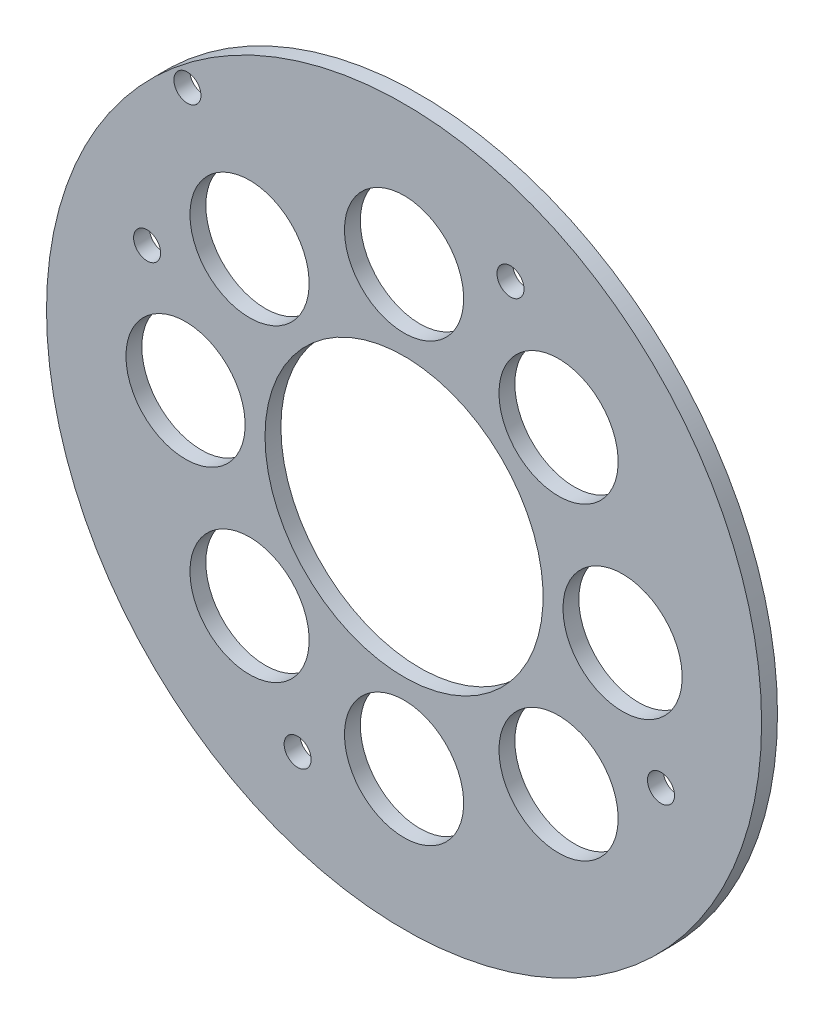
ISO-10303-21;
HEADER;
FILE_DESCRIPTION(('STEP AP214'),'2;1');
FILE_NAME('part.step','',(''),(''),'','','');
FILE_SCHEMA(('AUTOMOTIVE_DESIGN { 1 0 10303 214 1 1 1 1 }'));
ENDSEC;
DATA;
#1=APPLICATION_CONTEXT('core data for automotive mechanical design processes');
#2=APPLICATION_PROTOCOL_DEFINITION('international standard','automotive_design',2000,#1);
#3=PRODUCT_CONTEXT('',#1,'mechanical');
#4=PRODUCT('Part','Part','',(#3));
#5=PRODUCT_RELATED_PRODUCT_CATEGORY('part','',(#4));
#6=PRODUCT_DEFINITION_FORMATION('','',#4);
#7=PRODUCT_DEFINITION_CONTEXT('part definition',#1,'design');
#8=PRODUCT_DEFINITION('design','',#6,#7);
#9=PRODUCT_DEFINITION_SHAPE('','',#8);
#10=(LENGTH_UNIT() NAMED_UNIT(*) SI_UNIT(.MILLI.,.METRE.));
#11=(NAMED_UNIT(*) PLANE_ANGLE_UNIT() SI_UNIT($,.RADIAN.));
#12=(NAMED_UNIT(*) SI_UNIT($,.STERADIAN.) SOLID_ANGLE_UNIT());
#13=UNCERTAINTY_MEASURE_WITH_UNIT(LENGTH_MEASURE(1.E-05),#10,'distance_accuracy_value','');
#14=(GEOMETRIC_REPRESENTATION_CONTEXT(3) GLOBAL_UNCERTAINTY_ASSIGNED_CONTEXT((#13)) GLOBAL_UNIT_ASSIGNED_CONTEXT((#10,
#11,#12)) REPRESENTATION_CONTEXT('',''));
#15=CARTESIAN_POINT('',(0.,0.,0.));
#16=DIRECTION('',(0.,0.,1.));
#17=DIRECTION('',(1.,0.,0.));
#18=AXIS2_PLACEMENT_3D('',#15,#16,#17);
#19=CARTESIAN_POINT('',(0.,0.,14.));
#20=DIRECTION('',(0.,0.,1.));
#21=DIRECTION('',(1.,0.,0.));
#22=AXIS2_PLACEMENT_3D('',#19,#20,#21);
#23=PLANE('',#22);
#24=CARTESIAN_POINT('',(0.,0.,14.));
#25=DIRECTION('',(0.,0.,-1.));
#26=DIRECTION('',(-1.,0.,0.));
#27=AXIS2_PLACEMENT_3D('',#24,#25,#26);
#28=CIRCLE('',#27,17.5);
#29=CARTESIAN_POINT('',(-17.5,0.,14.));
#30=VERTEX_POINT('',#29);
#31=EDGE_CURVE('E133',#30,#30,#28,.T.);
#32=ORIENTED_EDGE('',*,*,#31,.T.);
#33=EDGE_LOOP('',(#32));
#34=FACE_BOUND('',#33,.T.);
#35=CARTESIAN_POINT('',(13.393920132778,32.3357836378951,14.));
#36=DIRECTION('',(0.,0.,-1.));
#37=DIRECTION('',(-1.,0.,0.));
#38=AXIS2_PLACEMENT_3D('',#35,#36,#37);
#39=CIRCLE('',#38,1.7);
#40=CARTESIAN_POINT('',(11.693920132778,32.3357836378951,14.));
#41=VERTEX_POINT('',#40);
#42=EDGE_CURVE('E94',#41,#41,#39,.T.);
#43=ORIENTED_EDGE('',*,*,#42,.T.);
#44=EDGE_LOOP('',(#43));
#45=FACE_BOUND('',#44,.T.);
#46=CARTESIAN_POINT('',(-13.3939201327779,-32.3357836378951,14.));
#47=DIRECTION('',(0.,0.,-1.));
#48=DIRECTION('',(-1.,0.,0.));
#49=AXIS2_PLACEMENT_3D('',#46,#47,#48);
#50=CIRCLE('',#49,1.7);
#51=CARTESIAN_POINT('',(-15.0939201327779,-32.3357836378951,14.));
#52=VERTEX_POINT('',#51);
#53=EDGE_CURVE('E91',#52,#52,#50,.T.);
#54=ORIENTED_EDGE('',*,*,#53,.T.);
#55=EDGE_LOOP('',(#54));
#56=FACE_BOUND('',#55,.T.);
#57=CARTESIAN_POINT('',(-32.3357836378951,13.393920132778,14.));
#58=DIRECTION('',(0.,0.,-1.));
#59=DIRECTION('',(-1.,0.,0.));
#60=AXIS2_PLACEMENT_3D('',#57,#58,#59);
#61=CIRCLE('',#60,1.7);
#62=CARTESIAN_POINT('',(-34.0357836378951,13.393920132778,14.));
#63=VERTEX_POINT('',#62);
#64=EDGE_CURVE('E88',#63,#63,#61,.T.);
#65=ORIENTED_EDGE('',*,*,#64,.T.);
#66=EDGE_LOOP('',(#65));
#67=FACE_BOUND('',#66,.T.);
#68=CARTESIAN_POINT('',(32.3357836378951,-13.3939201327779,14.));
#69=DIRECTION('',(0.,0.,-1.));
#70=DIRECTION('',(-1.,0.,0.));
#71=AXIS2_PLACEMENT_3D('',#68,#69,#70);
#72=CIRCLE('',#71,1.7);
#73=CARTESIAN_POINT('',(30.6357836378951,-13.3939201327779,14.));
#74=VERTEX_POINT('',#73);
#75=EDGE_CURVE('E85',#74,#74,#72,.T.);
#76=ORIENTED_EDGE('',*,*,#75,.T.);
#77=EDGE_LOOP('',(#76));
#78=FACE_BOUND('',#77,.T.);
#79=CARTESIAN_POINT('',(19.4454364826294,19.4454364826285,14.));
#80=DIRECTION('',(0.,0.,-1.));
#81=DIRECTION('',(-1.,0.,0.));
#82=AXIS2_PLACEMENT_3D('',#79,#80,#81);
#83=CIRCLE('',#82,7.5);
#84=CARTESIAN_POINT('',(11.9454364826294,19.4454364826285,14.));
#85=VERTEX_POINT('',#84);
#86=EDGE_CURVE('E82',#85,#85,#83,.T.);
#87=ORIENTED_EDGE('',*,*,#86,.T.);
#88=EDGE_LOOP('',(#87));
#89=FACE_BOUND('',#88,.T.);
#90=CARTESIAN_POINT('',(27.4999999999979,-2.13208744982998E-12,14.));
#91=DIRECTION('',(0.,0.,-1.));
#92=DIRECTION('',(-1.,0.,0.));
#93=AXIS2_PLACEMENT_3D('',#90,#91,#92);
#94=CIRCLE('',#93,7.5);
#95=CARTESIAN_POINT('',(19.9999999999979,-2.13208744982998E-12,14.));
#96=VERTEX_POINT('',#95);
#97=EDGE_CURVE('E79',#96,#96,#94,.T.);
#98=ORIENTED_EDGE('',*,*,#97,.T.);
#99=EDGE_LOOP('',(#98));
#100=FACE_BOUND('',#99,.T.);
#101=CARTESIAN_POINT('',(19.4454364826264,-19.4454364826316,14.));
#102=DIRECTION('',(0.,0.,-1.));
#103=DIRECTION('',(-1.,0.,0.));
#104=AXIS2_PLACEMENT_3D('',#101,#102,#103);
#105=CIRCLE('',#104,7.5);
#106=CARTESIAN_POINT('',(11.9454364826264,-19.4454364826316,14.));
#107=VERTEX_POINT('',#106);
#108=EDGE_CURVE('E76',#107,#107,#105,.T.);
#109=ORIENTED_EDGE('',*,*,#108,.T.);
#110=EDGE_LOOP('',(#109));
#111=FACE_BOUND('',#110,.T.);
#112=CARTESIAN_POINT('',(-4.25743934226465E-12,-27.5,14.));
#113=DIRECTION('',(0.,0.,-1.));
#114=DIRECTION('',(-1.,0.,0.));
#115=AXIS2_PLACEMENT_3D('',#112,#113,#114);
#116=CIRCLE('',#115,7.5);
#117=CARTESIAN_POINT('',(-7.50000000000426,-27.5,14.));
#118=VERTEX_POINT('',#117);
#119=EDGE_CURVE('E73',#118,#118,#116,.T.);
#120=ORIENTED_EDGE('',*,*,#119,.T.);
#121=EDGE_LOOP('',(#120));
#122=FACE_BOUND('',#121,.T.);
#123=CARTESIAN_POINT('',(-19.4454364826337,-19.4454364826286,14.));
#124=DIRECTION('',(0.,0.,-1.));
#125=DIRECTION('',(-1.,0.,0.));
#126=AXIS2_PLACEMENT_3D('',#123,#124,#125);
#127=CIRCLE('',#126,7.5);
#128=CARTESIAN_POINT('',(-26.9454364826337,-19.4454364826286,14.));
#129=VERTEX_POINT('',#128);
#130=EDGE_CURVE('E70',#129,#129,#127,.T.);
#131=ORIENTED_EDGE('',*,*,#130,.T.);
#132=EDGE_LOOP('',(#131));
#133=FACE_BOUND('',#132,.T.);
#134=CARTESIAN_POINT('',(-27.5000000000021,2.12871967113233E-12,14.));
#135=DIRECTION('',(0.,0.,-1.));
#136=DIRECTION('',(-1.,0.,0.));
#137=AXIS2_PLACEMENT_3D('',#134,#135,#136);
#138=CIRCLE('',#137,7.49999999999999);
#139=CARTESIAN_POINT('',(-35.0000000000021,2.12871967113233E-12,14.));
#140=VERTEX_POINT('',#139);
#141=EDGE_CURVE('E65',#140,#140,#138,.T.);
#142=ORIENTED_EDGE('',*,*,#141,.T.);
#143=EDGE_LOOP('',(#142));
#144=FACE_BOUND('',#143,.T.);
#145=CARTESIAN_POINT('',(-19.4454364826307,19.4454364826316,14.));
#146=DIRECTION('',(0.,0.,-1.));
#147=DIRECTION('',(-1.,0.,0.));
#148=AXIS2_PLACEMENT_3D('',#145,#146,#147);
#149=CIRCLE('',#148,7.5);
#150=CARTESIAN_POINT('',(-26.9454364826307,19.4454364826316,14.));
#151=VERTEX_POINT('',#150);
#152=EDGE_CURVE('E61',#151,#151,#149,.T.);
#153=ORIENTED_EDGE('',*,*,#152,.T.);
#154=EDGE_LOOP('',(#153));
#155=FACE_BOUND('',#154,.T.);
#156=CARTESIAN_POINT('',(0.,27.5,14.));
#157=DIRECTION('',(0.,0.,-1.));
#158=DIRECTION('',(-1.,0.,0.));
#159=AXIS2_PLACEMENT_3D('',#156,#157,#158);
#160=CIRCLE('',#159,7.5);
#161=CARTESIAN_POINT('',(-7.5,27.5,14.));
#162=VERTEX_POINT('',#161);
#163=EDGE_CURVE('E57',#162,#162,#160,.T.);
#164=ORIENTED_EDGE('',*,*,#163,.T.);
#165=EDGE_LOOP('',(#164));
#166=FACE_BOUND('',#165,.T.);
#167=CARTESIAN_POINT('',(-27.2631166743693,33.1207642969602,14.));
#168=DIRECTION('',(0.,0.,1.));
#169=DIRECTION('',(1.,0.,0.));
#170=AXIS2_PLACEMENT_3D('',#167,#168,#169);
#171=CIRCLE('',#170,1.7);
#172=CARTESIAN_POINT('',(-25.5631166743693,33.1207642969602,14.));
#173=VERTEX_POINT('',#172);
#174=EDGE_CURVE('E51',#173,#173,#171,.T.);
#175=ORIENTED_EDGE('',*,*,#174,.F.);
#176=EDGE_LOOP('',(#175));
#177=FACE_BOUND('',#176,.T.);
#178=CARTESIAN_POINT('',(0.,0.,14.));
#179=DIRECTION('',(0.,0.,1.));
#180=DIRECTION('',(1.,0.,0.));
#181=AXIS2_PLACEMENT_3D('',#178,#179,#180);
#182=CIRCLE('',#181,45.);
#183=CARTESIAN_POINT('',(45.,0.,14.));
#184=VERTEX_POINT('',#183);
#185=EDGE_CURVE('E10',#184,#184,#182,.T.);
#186=ORIENTED_EDGE('',*,*,#185,.T.);
#187=EDGE_LOOP('',(#186));
#188=FACE_BOUND('',#187,.T.);
#189=ADVANCED_FACE('F35',(#34,#45,#56,#67,#78,#89,#100,#111,#122,#133,#144,#155,#166,#177,#188),
#23,.T.);
#190=CARTESIAN_POINT('',(0.,0.,12.));
#191=DIRECTION('',(0.,0.,1.));
#192=DIRECTION('',(1.,0.,0.));
#193=AXIS2_PLACEMENT_3D('',#190,#191,#192);
#194=PLANE('',#193);
#195=CARTESIAN_POINT('',(0.,0.,12.));
#196=DIRECTION('',(0.,0.,-1.));
#197=DIRECTION('',(-1.,0.,0.));
#198=AXIS2_PLACEMENT_3D('',#195,#196,#197);
#199=CIRCLE('',#198,17.5);
#200=CARTESIAN_POINT('',(-17.5,0.,12.));
#201=VERTEX_POINT('',#200);
#202=EDGE_CURVE('E130',#201,#201,#199,.T.);
#203=ORIENTED_EDGE('',*,*,#202,.F.);
#204=EDGE_LOOP('',(#203));
#205=FACE_BOUND('',#204,.T.);
#206=CARTESIAN_POINT('',(-27.2631166743693,33.1207642969602,12.));
#207=DIRECTION('',(0.,0.,1.));
#208=DIRECTION('',(1.,0.,0.));
#209=AXIS2_PLACEMENT_3D('',#206,#207,#208);
#210=CIRCLE('',#209,1.7);
#211=CARTESIAN_POINT('',(-25.5631166743693,33.1207642969602,12.));
#212=VERTEX_POINT('',#211);
#213=EDGE_CURVE('E48',#212,#212,#210,.T.);
#214=ORIENTED_EDGE('',*,*,#213,.T.);
#215=EDGE_LOOP('',(#214));
#216=FACE_BOUND('',#215,.T.);
#217=CARTESIAN_POINT('',(0.,0.,12.));
#218=DIRECTION('',(0.,0.,1.));
#219=DIRECTION('',(1.,0.,0.));
#220=AXIS2_PLACEMENT_3D('',#217,#218,#219);
#221=CIRCLE('',#220,45.);
#222=CARTESIAN_POINT('',(45.,0.,12.));
#223=VERTEX_POINT('',#222);
#224=EDGE_CURVE('E43',#223,#223,#221,.T.);
#225=ORIENTED_EDGE('',*,*,#224,.F.);
#226=EDGE_LOOP('',(#225));
#227=FACE_BOUND('',#226,.T.);
#228=CARTESIAN_POINT('',(-19.4454364826307,19.4454364826316,12.));
#229=DIRECTION('',(0.,0.,1.));
#230=DIRECTION('',(1.,0.,0.));
#231=AXIS2_PLACEMENT_3D('',#228,#229,#230);
#232=CIRCLE('',#231,7.5);
#233=CARTESIAN_POINT('',(-11.9454364826307,19.4454364826316,12.));
#234=VERTEX_POINT('',#233);
#235=EDGE_CURVE('E100',#234,#234,#232,.F.);
#236=ORIENTED_EDGE('',*,*,#235,.F.);
#237=EDGE_LOOP('',(#236));
#238=FACE_BOUND('',#237,.T.);
#239=CARTESIAN_POINT('',(-19.4454364826337,-19.4454364826286,12.));
#240=DIRECTION('',(0.,0.,1.));
#241=DIRECTION('',(1.,0.,0.));
#242=AXIS2_PLACEMENT_3D('',#239,#240,#241);
#243=CIRCLE('',#242,7.5);
#244=CARTESIAN_POINT('',(-11.9454364826337,-19.4454364826286,12.));
#245=VERTEX_POINT('',#244);
#246=EDGE_CURVE('E106',#245,#245,#243,.F.);
#247=ORIENTED_EDGE('',*,*,#246,.F.);
#248=EDGE_LOOP('',(#247));
#249=FACE_BOUND('',#248,.T.);
#250=CARTESIAN_POINT('',(19.4454364826264,-19.4454364826316,12.));
#251=DIRECTION('',(0.,0.,1.));
#252=DIRECTION('',(1.,0.,0.));
#253=AXIS2_PLACEMENT_3D('',#250,#251,#252);
#254=CIRCLE('',#253,7.5);
#255=CARTESIAN_POINT('',(26.9454364826264,-19.4454364826316,12.));
#256=VERTEX_POINT('',#255);
#257=EDGE_CURVE('E112',#256,#256,#254,.F.);
#258=ORIENTED_EDGE('',*,*,#257,.F.);
#259=EDGE_LOOP('',(#258));
#260=FACE_BOUND('',#259,.T.);
#261=CARTESIAN_POINT('',(19.4454364826294,19.4454364826285,12.));
#262=DIRECTION('',(0.,0.,1.));
#263=DIRECTION('',(1.,0.,0.));
#264=AXIS2_PLACEMENT_3D('',#261,#262,#263);
#265=CIRCLE('',#264,7.5);
#266=CARTESIAN_POINT('',(26.9454364826294,19.4454364826285,12.));
#267=VERTEX_POINT('',#266);
#268=EDGE_CURVE('E118',#267,#267,#265,.F.);
#269=ORIENTED_EDGE('',*,*,#268,.F.);
#270=EDGE_LOOP('',(#269));
#271=FACE_BOUND('',#270,.T.);
#272=CARTESIAN_POINT('',(-32.3357836378951,13.393920132778,12.));
#273=DIRECTION('',(0.,0.,1.));
#274=DIRECTION('',(1.,0.,0.));
#275=AXIS2_PLACEMENT_3D('',#272,#273,#274);
#276=CIRCLE('',#275,1.69999999999999);
#277=CARTESIAN_POINT('',(-30.6357836378951,13.393920132778,12.));
#278=VERTEX_POINT('',#277);
#279=EDGE_CURVE('E124',#278,#278,#276,.F.);
#280=ORIENTED_EDGE('',*,*,#279,.F.);
#281=EDGE_LOOP('',(#280));
#282=FACE_BOUND('',#281,.T.);
#283=CARTESIAN_POINT('',(13.393920132778,32.3357836378951,12.));
#284=DIRECTION('',(0.,0.,1.));
#285=DIRECTION('',(1.,0.,0.));
#286=AXIS2_PLACEMENT_3D('',#283,#284,#285);
#287=CIRCLE('',#286,1.69999999999999);
#288=CARTESIAN_POINT('',(15.093920132778,32.3357836378951,12.));
#289=VERTEX_POINT('',#288);
#290=EDGE_CURVE('E39',#289,#289,#287,.F.);
#291=ORIENTED_EDGE('',*,*,#290,.F.);
#292=EDGE_LOOP('',(#291));
#293=FACE_BOUND('',#292,.T.);
#294=CARTESIAN_POINT('',(-13.3939201327779,-32.3357836378951,12.));
#295=DIRECTION('',(0.,0.,1.));
#296=DIRECTION('',(1.,0.,0.));
#297=AXIS2_PLACEMENT_3D('',#294,#295,#296);
#298=CIRCLE('',#297,1.69999999999999);
#299=CARTESIAN_POINT('',(-11.6939201327779,-32.3357836378951,12.));
#300=VERTEX_POINT('',#299);
#301=EDGE_CURVE('E127',#300,#300,#298,.F.);
#302=ORIENTED_EDGE('',*,*,#301,.F.);
#303=EDGE_LOOP('',(#302));
#304=FACE_BOUND('',#303,.T.);
#305=CARTESIAN_POINT('',(32.3357836378951,-13.3939201327779,12.));
#306=DIRECTION('',(0.,0.,1.));
#307=DIRECTION('',(1.,0.,0.));
#308=AXIS2_PLACEMENT_3D('',#305,#306,#307);
#309=CIRCLE('',#308,1.69999999999999);
#310=CARTESIAN_POINT('',(34.0357836378951,-13.3939201327779,12.));
#311=VERTEX_POINT('',#310);
#312=EDGE_CURVE('E121',#311,#311,#309,.F.);
#313=ORIENTED_EDGE('',*,*,#312,.F.);
#314=EDGE_LOOP('',(#313));
#315=FACE_BOUND('',#314,.T.);
#316=CARTESIAN_POINT('',(27.4999999999979,-2.13208744982998E-12,12.));
#317=DIRECTION('',(0.,0.,1.));
#318=DIRECTION('',(1.,0.,0.));
#319=AXIS2_PLACEMENT_3D('',#316,#317,#318);
#320=CIRCLE('',#319,7.5);
#321=CARTESIAN_POINT('',(34.9999999999979,-2.13208744982998E-12,12.));
#322=VERTEX_POINT('',#321);
#323=EDGE_CURVE('E115',#322,#322,#320,.F.);
#324=ORIENTED_EDGE('',*,*,#323,.F.);
#325=EDGE_LOOP('',(#324));
#326=FACE_BOUND('',#325,.T.);
#327=CARTESIAN_POINT('',(-4.25743934226465E-12,-27.5,12.));
#328=DIRECTION('',(0.,0.,1.));
#329=DIRECTION('',(1.,0.,0.));
#330=AXIS2_PLACEMENT_3D('',#327,#328,#329);
#331=CIRCLE('',#330,7.5);
#332=CARTESIAN_POINT('',(7.49999999999574,-27.5,12.));
#333=VERTEX_POINT('',#332);
#334=EDGE_CURVE('E109',#333,#333,#331,.F.);
#335=ORIENTED_EDGE('',*,*,#334,.F.);
#336=EDGE_LOOP('',(#335));
#337=FACE_BOUND('',#336,.T.);
#338=CARTESIAN_POINT('',(-27.5000000000021,2.12871967113233E-12,12.));
#339=DIRECTION('',(0.,0.,1.));
#340=DIRECTION('',(1.,0.,0.));
#341=AXIS2_PLACEMENT_3D('',#338,#339,#340);
#342=CIRCLE('',#341,7.49999999999999);
#343=CARTESIAN_POINT('',(-20.0000000000021,2.12871967113233E-12,12.));
#344=VERTEX_POINT('',#343);
#345=EDGE_CURVE('E103',#344,#344,#342,.F.);
#346=ORIENTED_EDGE('',*,*,#345,.F.);
#347=EDGE_LOOP('',(#346));
#348=FACE_BOUND('',#347,.T.);
#349=CARTESIAN_POINT('',(0.,27.5,12.));
#350=DIRECTION('',(0.,0.,1.));
#351=DIRECTION('',(1.,0.,0.));
#352=AXIS2_PLACEMENT_3D('',#349,#350,#351);
#353=CIRCLE('',#352,7.5);
#354=CARTESIAN_POINT('',(7.5,27.5,12.));
#355=VERTEX_POINT('',#354);
#356=EDGE_CURVE('E97',#355,#355,#353,.F.);
#357=ORIENTED_EDGE('',*,*,#356,.F.);
#358=EDGE_LOOP('',(#357));
#359=FACE_BOUND('',#358,.T.);
#360=ADVANCED_FACE('F143',(#205,#216,#227,#238,#249,#260,#271,#282,#293,#304,#315,#326,#337,
#348,#359),#194,.F.);
#361=CARTESIAN_POINT('',(0.,0.,14.));
#362=DIRECTION('',(0.,0.,-1.));
#363=DIRECTION('',(-1.,0.,0.));
#364=AXIS2_PLACEMENT_3D('',#361,#362,#363);
#365=CYLINDRICAL_SURFACE('',#364,45.);
#366=ORIENTED_EDGE('',*,*,#185,.F.);
#367=EDGE_LOOP('',(#366));
#368=FACE_BOUND('',#367,.T.);
#369=ORIENTED_EDGE('',*,*,#224,.T.);
#370=EDGE_LOOP('',(#369));
#371=FACE_BOUND('',#370,.T.);
#372=ADVANCED_FACE('F37',(#368,#371),#365,.T.);
#373=CARTESIAN_POINT('',(-27.2631166743693,33.1207642969602,14.));
#374=DIRECTION('',(0.,0.,1.));
#375=DIRECTION('',(1.,0.,0.));
#376=AXIS2_PLACEMENT_3D('',#373,#374,#375);
#377=CYLINDRICAL_SURFACE('',#376,1.7);
#378=ORIENTED_EDGE('',*,*,#174,.T.);
#379=EDGE_LOOP('',(#378));
#380=FACE_BOUND('',#379,.T.);
#381=ORIENTED_EDGE('',*,*,#213,.F.);
#382=EDGE_LOOP('',(#381));
#383=FACE_BOUND('',#382,.T.);
#384=ADVANCED_FACE('F163',(#380,#383),#377,.F.);
#385=CARTESIAN_POINT('',(0.,27.5,14.));
#386=DIRECTION('',(0.,0.,-1.));
#387=DIRECTION('',(-1.,0.,0.));
#388=AXIS2_PLACEMENT_3D('',#385,#386,#387);
#389=CYLINDRICAL_SURFACE('',#388,7.5);
#390=ORIENTED_EDGE('',*,*,#356,.T.);
#391=EDGE_LOOP('',(#390));
#392=FACE_BOUND('',#391,.T.);
#393=ORIENTED_EDGE('',*,*,#163,.F.);
#394=EDGE_LOOP('',(#393));
#395=FACE_BOUND('',#394,.T.);
#396=ADVANCED_FACE('F159',(#392,#395),#389,.F.);
#397=CARTESIAN_POINT('',(-19.4454364826307,19.4454364826316,14.));
#398=DIRECTION('',(0.,0.,-1.));
#399=DIRECTION('',(-1.,0.,0.));
#400=AXIS2_PLACEMENT_3D('',#397,#398,#399);
#401=CYLINDRICAL_SURFACE('',#400,7.5);
#402=ORIENTED_EDGE('',*,*,#235,.T.);
#403=EDGE_LOOP('',(#402));
#404=FACE_BOUND('',#403,.T.);
#405=ORIENTED_EDGE('',*,*,#152,.F.);
#406=EDGE_LOOP('',(#405));
#407=FACE_BOUND('',#406,.T.);
#408=ADVANCED_FACE('F162',(#404,#407),#401,.F.);
#409=CARTESIAN_POINT('',(-27.5000000000021,2.12871967113233E-12,14.));
#410=DIRECTION('',(0.,0.,-1.));
#411=DIRECTION('',(-1.,0.,0.));
#412=AXIS2_PLACEMENT_3D('',#409,#410,#411);
#413=CYLINDRICAL_SURFACE('',#412,7.49999999999999);
#414=ORIENTED_EDGE('',*,*,#345,.T.);
#415=EDGE_LOOP('',(#414));
#416=FACE_BOUND('',#415,.T.);
#417=ORIENTED_EDGE('',*,*,#141,.F.);
#418=EDGE_LOOP('',(#417));
#419=FACE_BOUND('',#418,.T.);
#420=ADVANCED_FACE('F169',(#416,#419),#413,.F.);
#421=CARTESIAN_POINT('',(-19.4454364826337,-19.4454364826286,14.));
#422=DIRECTION('',(0.,0.,-1.));
#423=DIRECTION('',(-1.,0.,0.));
#424=AXIS2_PLACEMENT_3D('',#421,#422,#423);
#425=CYLINDRICAL_SURFACE('',#424,7.5);
#426=ORIENTED_EDGE('',*,*,#246,.T.);
#427=EDGE_LOOP('',(#426));
#428=FACE_BOUND('',#427,.T.);
#429=ORIENTED_EDGE('',*,*,#130,.F.);
#430=EDGE_LOOP('',(#429));
#431=FACE_BOUND('',#430,.T.);
#432=ADVANCED_FACE('F204',(#428,#431),#425,.F.);
#433=CARTESIAN_POINT('',(-4.25743934226465E-12,-27.5,14.));
#434=DIRECTION('',(0.,0.,-1.));
#435=DIRECTION('',(-1.,0.,0.));
#436=AXIS2_PLACEMENT_3D('',#433,#434,#435);
#437=CYLINDRICAL_SURFACE('',#436,7.5);
#438=ORIENTED_EDGE('',*,*,#334,.T.);
#439=EDGE_LOOP('',(#438));
#440=FACE_BOUND('',#439,.T.);
#441=ORIENTED_EDGE('',*,*,#119,.F.);
#442=EDGE_LOOP('',(#441));
#443=FACE_BOUND('',#442,.T.);
#444=ADVANCED_FACE('F210',(#440,#443),#437,.F.);
#445=CARTESIAN_POINT('',(19.4454364826264,-19.4454364826316,14.));
#446=DIRECTION('',(0.,0.,-1.));
#447=DIRECTION('',(-1.,0.,0.));
#448=AXIS2_PLACEMENT_3D('',#445,#446,#447);
#449=CYLINDRICAL_SURFACE('',#448,7.5);
#450=ORIENTED_EDGE('',*,*,#257,.T.);
#451=EDGE_LOOP('',(#450));
#452=FACE_BOUND('',#451,.T.);
#453=ORIENTED_EDGE('',*,*,#108,.F.);
#454=EDGE_LOOP('',(#453));
#455=FACE_BOUND('',#454,.T.);
#456=ADVANCED_FACE('F216',(#452,#455),#449,.F.);
#457=CARTESIAN_POINT('',(27.4999999999979,-2.13208744982998E-12,14.));
#458=DIRECTION('',(0.,0.,-1.));
#459=DIRECTION('',(-1.,0.,0.));
#460=AXIS2_PLACEMENT_3D('',#457,#458,#459);
#461=CYLINDRICAL_SURFACE('',#460,7.5);
#462=ORIENTED_EDGE('',*,*,#323,.T.);
#463=EDGE_LOOP('',(#462));
#464=FACE_BOUND('',#463,.T.);
#465=ORIENTED_EDGE('',*,*,#97,.F.);
#466=EDGE_LOOP('',(#465));
#467=FACE_BOUND('',#466,.T.);
#468=ADVANCED_FACE('F220',(#464,#467),#461,.F.);
#469=CARTESIAN_POINT('',(19.4454364826294,19.4454364826285,14.));
#470=DIRECTION('',(0.,0.,-1.));
#471=DIRECTION('',(-1.,0.,0.));
#472=AXIS2_PLACEMENT_3D('',#469,#470,#471);
#473=CYLINDRICAL_SURFACE('',#472,7.5);
#474=ORIENTED_EDGE('',*,*,#268,.T.);
#475=EDGE_LOOP('',(#474));
#476=FACE_BOUND('',#475,.T.);
#477=ORIENTED_EDGE('',*,*,#86,.F.);
#478=EDGE_LOOP('',(#477));
#479=FACE_BOUND('',#478,.T.);
#480=ADVANCED_FACE('F224',(#476,#479),#473,.F.);
#481=CARTESIAN_POINT('',(32.3357836378951,-13.3939201327779,0.));
#482=DIRECTION('',(0.,0.,-1.));
#483=DIRECTION('',(-1.,0.,0.));
#484=AXIS2_PLACEMENT_3D('',#481,#482,#483);
#485=CYLINDRICAL_SURFACE('',#484,1.69999999999999);
#486=ORIENTED_EDGE('',*,*,#312,.T.);
#487=EDGE_LOOP('',(#486));
#488=FACE_BOUND('',#487,.T.);
#489=ORIENTED_EDGE('',*,*,#75,.F.);
#490=EDGE_LOOP('',(#489));
#491=FACE_BOUND('',#490,.T.);
#492=ADVANCED_FACE('F228',(#488,#491),#485,.F.);
#493=CARTESIAN_POINT('',(-32.3357836378951,13.393920132778,0.));
#494=DIRECTION('',(0.,0.,-1.));
#495=DIRECTION('',(-1.,0.,0.));
#496=AXIS2_PLACEMENT_3D('',#493,#494,#495);
#497=CYLINDRICAL_SURFACE('',#496,1.69999999999999);
#498=ORIENTED_EDGE('',*,*,#279,.T.);
#499=EDGE_LOOP('',(#498));
#500=FACE_BOUND('',#499,.T.);
#501=ORIENTED_EDGE('',*,*,#64,.F.);
#502=EDGE_LOOP('',(#501));
#503=FACE_BOUND('',#502,.T.);
#504=ADVANCED_FACE('F232',(#500,#503),#497,.F.);
#505=CARTESIAN_POINT('',(-13.3939201327779,-32.3357836378951,0.));
#506=DIRECTION('',(0.,0.,-1.));
#507=DIRECTION('',(-1.,0.,0.));
#508=AXIS2_PLACEMENT_3D('',#505,#506,#507);
#509=CYLINDRICAL_SURFACE('',#508,1.69999999999999);
#510=ORIENTED_EDGE('',*,*,#301,.T.);
#511=EDGE_LOOP('',(#510));
#512=FACE_BOUND('',#511,.T.);
#513=ORIENTED_EDGE('',*,*,#53,.F.);
#514=EDGE_LOOP('',(#513));
#515=FACE_BOUND('',#514,.T.);
#516=ADVANCED_FACE('F236',(#512,#515),#509,.F.);
#517=CARTESIAN_POINT('',(13.393920132778,32.3357836378951,0.));
#518=DIRECTION('',(0.,0.,-1.));
#519=DIRECTION('',(-1.,0.,0.));
#520=AXIS2_PLACEMENT_3D('',#517,#518,#519);
#521=CYLINDRICAL_SURFACE('',#520,1.69999999999999);
#522=ORIENTED_EDGE('',*,*,#290,.T.);
#523=EDGE_LOOP('',(#522));
#524=FACE_BOUND('',#523,.T.);
#525=ORIENTED_EDGE('',*,*,#42,.F.);
#526=EDGE_LOOP('',(#525));
#527=FACE_BOUND('',#526,.T.);
#528=ADVANCED_FACE('F140',(#524,#527),#521,.F.);
#529=CARTESIAN_POINT('',(0.,0.,14.));
#530=DIRECTION('',(0.,0.,-1.));
#531=DIRECTION('',(-1.,0.,0.));
#532=AXIS2_PLACEMENT_3D('',#529,#530,#531);
#533=CYLINDRICAL_SURFACE('',#532,17.5);
#534=ORIENTED_EDGE('',*,*,#31,.F.);
#535=EDGE_LOOP('',(#534));
#536=FACE_BOUND('',#535,.T.);
#537=ORIENTED_EDGE('',*,*,#202,.T.);
#538=EDGE_LOOP('',(#537));
#539=FACE_BOUND('',#538,.T.);
#540=ADVANCED_FACE('F243',(#536,#539),#533,.F.);
#541=CLOSED_SHELL('',(#189,#360,#372,#384,#396,#408,#420,#432,#444,#456,#468,#480,#492,#504,
#516,#528,#540));
#542=MANIFOLD_SOLID_BREP('B2',#541);
#543=ADVANCED_BREP_SHAPE_REPRESENTATION('',(#18,#542),#14);
#544=SHAPE_DEFINITION_REPRESENTATION(#9,#543);
ENDSEC;
END-ISO-10303-21;
